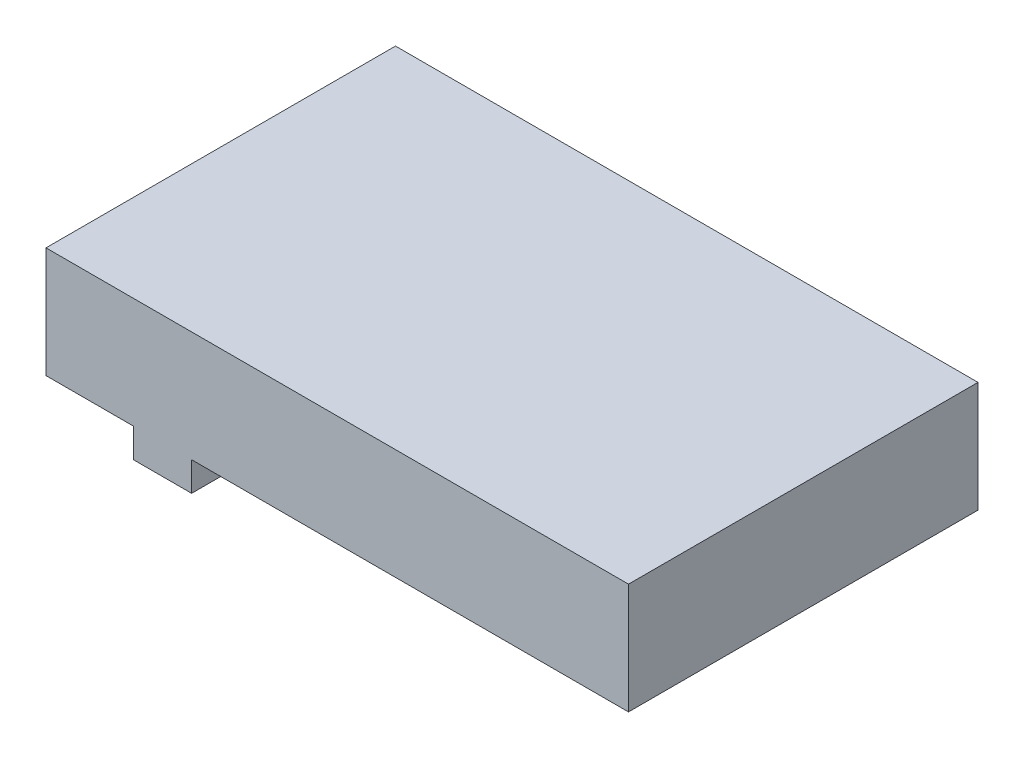
ISO-10303-21;
HEADER;
FILE_DESCRIPTION(('STEP AP214'),'2;1');
FILE_NAME('part.step','',(''),(''),'','','');
FILE_SCHEMA(('AUTOMOTIVE_DESIGN { 1 0 10303 214 1 1 1 1 }'));
ENDSEC;
DATA;
#1=APPLICATION_CONTEXT('core data for automotive mechanical design processes');
#2=APPLICATION_PROTOCOL_DEFINITION('international standard','automotive_design',2000,#1);
#3=PRODUCT_CONTEXT('',#1,'mechanical');
#4=PRODUCT('Part','Part','',(#3));
#5=PRODUCT_RELATED_PRODUCT_CATEGORY('part','',(#4));
#6=PRODUCT_DEFINITION_FORMATION('','',#4);
#7=PRODUCT_DEFINITION_CONTEXT('part definition',#1,'design');
#8=PRODUCT_DEFINITION('design','',#6,#7);
#9=PRODUCT_DEFINITION_SHAPE('','',#8);
#10=(LENGTH_UNIT() NAMED_UNIT(*) SI_UNIT(.MILLI.,.METRE.));
#11=(NAMED_UNIT(*) PLANE_ANGLE_UNIT() SI_UNIT($,.RADIAN.));
#12=(NAMED_UNIT(*) SI_UNIT($,.STERADIAN.) SOLID_ANGLE_UNIT());
#13=UNCERTAINTY_MEASURE_WITH_UNIT(LENGTH_MEASURE(1.E-05),#10,'distance_accuracy_value','');
#14=(GEOMETRIC_REPRESENTATION_CONTEXT(3) GLOBAL_UNCERTAINTY_ASSIGNED_CONTEXT((#13)) GLOBAL_UNIT_ASSIGNED_CONTEXT((#10,
#11,#12)) REPRESENTATION_CONTEXT('',''));
#15=CARTESIAN_POINT('',(0.,0.,0.));
#16=DIRECTION('',(0.,0.,1.));
#17=DIRECTION('',(1.,0.,0.));
#18=AXIS2_PLACEMENT_3D('',#15,#16,#17);
#19=CARTESIAN_POINT('',(-12.7,-2.413,15.24));
#20=DIRECTION('',(0.,1.,0.));
#21=DIRECTION('',(0.,0.,1.));
#22=AXIS2_PLACEMENT_3D('',#19,#20,#21);
#23=PLANE('',#22);
#24=DIRECTION('',(0.,0.,1.));
#25=VECTOR('',#24,1.);
#26=CARTESIAN_POINT('',(-6.35,-2.413,0.));
#27=LINE('',#26,#25);
#28=CARTESIAN_POINT('',(-6.35,-2.413,0.));
#29=VERTEX_POINT('',#28);
#30=CARTESIAN_POINT('',(-6.35,-2.413,15.24));
#31=VERTEX_POINT('',#30);
#32=EDGE_CURVE('E153',#29,#31,#27,.T.);
#33=ORIENTED_EDGE('',*,*,#32,.F.);
#34=DIRECTION('',(1.,0.,0.));
#35=VECTOR('',#34,1.);
#36=CARTESIAN_POINT('',(-12.7,-2.413,0.));
#37=LINE('',#36,#35);
#38=CARTESIAN_POINT('',(12.7,-2.413,0.));
#39=VERTEX_POINT('',#38);
#40=EDGE_CURVE('E86',#29,#39,#37,.T.);
#41=ORIENTED_EDGE('',*,*,#40,.T.);
#42=DIRECTION('',(0.,0.,-1.));
#43=VECTOR('',#42,1.);
#44=CARTESIAN_POINT('',(12.7,-2.413,15.24));
#45=LINE('',#44,#43);
#46=CARTESIAN_POINT('',(12.7,-2.413,15.24));
#47=VERTEX_POINT('',#46);
#48=EDGE_CURVE('E171',#47,#39,#45,.T.);
#49=ORIENTED_EDGE('',*,*,#48,.F.);
#50=DIRECTION('',(1.,0.,0.));
#51=VECTOR('',#50,1.);
#52=CARTESIAN_POINT('',(-12.7,-2.413,15.24));
#53=LINE('',#52,#51);
#54=EDGE_CURVE('E64',#31,#47,#53,.T.);
#55=ORIENTED_EDGE('',*,*,#54,.F.);
#56=EDGE_LOOP('',(#33,#41,#49,#55));
#57=FACE_BOUND('',#56,.T.);
#58=ADVANCED_FACE('F39',(#57),#23,.F.);
#59=CARTESIAN_POINT('',(12.7,-2.413,15.24));
#60=DIRECTION('',(-1.,0.,0.));
#61=DIRECTION('',(0.,0.,1.));
#62=AXIS2_PLACEMENT_3D('',#59,#60,#61);
#63=PLANE('',#62);
#64=DIRECTION('',(0.,1.,0.));
#65=VECTOR('',#64,1.);
#66=CARTESIAN_POINT('',(12.7,-2.413,0.));
#67=LINE('',#66,#65);
#68=CARTESIAN_POINT('',(12.7,2.413,0.));
#69=VERTEX_POINT('',#68);
#70=EDGE_CURVE('E152',#39,#69,#67,.T.);
#71=ORIENTED_EDGE('',*,*,#70,.T.);
#72=DIRECTION('',(0.,0.,-1.));
#73=VECTOR('',#72,1.);
#74=CARTESIAN_POINT('',(12.7,2.413,15.24));
#75=LINE('',#74,#73);
#76=CARTESIAN_POINT('',(12.7,2.413,15.24));
#77=VERTEX_POINT('',#76);
#78=EDGE_CURVE('E11',#77,#69,#75,.T.);
#79=ORIENTED_EDGE('',*,*,#78,.F.);
#80=DIRECTION('',(0.,1.,0.));
#81=VECTOR('',#80,1.);
#82=CARTESIAN_POINT('',(12.7,-2.413,15.24));
#83=LINE('',#82,#81);
#84=EDGE_CURVE('E158',#47,#77,#83,.T.);
#85=ORIENTED_EDGE('',*,*,#84,.F.);
#86=ORIENTED_EDGE('',*,*,#48,.T.);
#87=EDGE_LOOP('',(#71,#79,#85,#86));
#88=FACE_BOUND('',#87,.T.);
#89=ADVANCED_FACE('F41',(#88),#63,.F.);
#90=CARTESIAN_POINT('',(-12.7,2.413,15.24));
#91=DIRECTION('',(0.,-1.,0.));
#92=DIRECTION('',(0.,0.,-1.));
#93=AXIS2_PLACEMENT_3D('',#90,#91,#92);
#94=PLANE('',#93);
#95=DIRECTION('',(-1.,0.,0.));
#96=VECTOR('',#95,1.);
#97=CARTESIAN_POINT('',(-12.7,2.413,0.));
#98=LINE('',#97,#96);
#99=CARTESIAN_POINT('',(-12.7,2.413,0.));
#100=VERTEX_POINT('',#99);
#101=EDGE_CURVE('E175',#69,#100,#98,.T.);
#102=ORIENTED_EDGE('',*,*,#101,.T.);
#103=DIRECTION('',(0.,0.,-1.));
#104=VECTOR('',#103,1.);
#105=CARTESIAN_POINT('',(-12.7,2.413,15.24));
#106=LINE('',#105,#104);
#107=CARTESIAN_POINT('',(-12.7,2.413,15.24));
#108=VERTEX_POINT('',#107);
#109=EDGE_CURVE('E48',#108,#100,#106,.T.);
#110=ORIENTED_EDGE('',*,*,#109,.F.);
#111=DIRECTION('',(-1.,0.,0.));
#112=VECTOR('',#111,1.);
#113=CARTESIAN_POINT('',(-12.7,2.413,15.24));
#114=LINE('',#113,#112);
#115=EDGE_CURVE('E93',#77,#108,#114,.T.);
#116=ORIENTED_EDGE('',*,*,#115,.F.);
#117=ORIENTED_EDGE('',*,*,#78,.T.);
#118=EDGE_LOOP('',(#102,#110,#116,#117));
#119=FACE_BOUND('',#118,.T.);
#120=ADVANCED_FACE('F202',(#119),#94,.F.);
#121=CARTESIAN_POINT('',(-12.7,-2.413,15.24));
#122=DIRECTION('',(1.,0.,0.));
#123=DIRECTION('',(0.,0.,-1.));
#124=AXIS2_PLACEMENT_3D('',#121,#122,#123);
#125=PLANE('',#124);
#126=DIRECTION('',(0.,-1.,0.));
#127=VECTOR('',#126,1.);
#128=CARTESIAN_POINT('',(-12.7,-2.413,0.));
#129=LINE('',#128,#127);
#130=CARTESIAN_POINT('',(-12.7,-2.413,0.));
#131=VERTEX_POINT('',#130);
#132=EDGE_CURVE('E178',#100,#131,#129,.T.);
#133=ORIENTED_EDGE('',*,*,#132,.T.);
#134=DIRECTION('',(0.,0.,-1.));
#135=VECTOR('',#134,1.);
#136=CARTESIAN_POINT('',(-12.7,-2.413,15.24));
#137=LINE('',#136,#135);
#138=CARTESIAN_POINT('',(-12.7,-2.413,15.24));
#139=VERTEX_POINT('',#138);
#140=EDGE_CURVE('E185',#139,#131,#137,.T.);
#141=ORIENTED_EDGE('',*,*,#140,.F.);
#142=DIRECTION('',(0.,-1.,0.));
#143=VECTOR('',#142,1.);
#144=CARTESIAN_POINT('',(-12.7,-2.413,15.24));
#145=LINE('',#144,#143);
#146=EDGE_CURVE('E164',#108,#139,#145,.T.);
#147=ORIENTED_EDGE('',*,*,#146,.F.);
#148=ORIENTED_EDGE('',*,*,#109,.T.);
#149=EDGE_LOOP('',(#133,#141,#147,#148));
#150=FACE_BOUND('',#149,.T.);
#151=ADVANCED_FACE('F193',(#150),#125,.F.);
#152=CARTESIAN_POINT('',(-8.89,-2.413,0.));
#153=VERTEX_POINT('',#152);
#154=EDGE_CURVE('E161',#131,#153,#37,.T.);
#155=ORIENTED_EDGE('',*,*,#154,.T.);
#156=DIRECTION('',(0.,0.,1.));
#157=VECTOR('',#156,1.);
#158=CARTESIAN_POINT('',(-8.89,-2.413,0.));
#159=LINE('',#158,#157);
#160=CARTESIAN_POINT('',(-8.89,-2.413,15.24));
#161=VERTEX_POINT('',#160);
#162=EDGE_CURVE('E137',#153,#161,#159,.T.);
#163=ORIENTED_EDGE('',*,*,#162,.T.);
#164=EDGE_CURVE('E167',#139,#161,#53,.T.);
#165=ORIENTED_EDGE('',*,*,#164,.F.);
#166=ORIENTED_EDGE('',*,*,#140,.T.);
#167=EDGE_LOOP('',(#155,#163,#165,#166));
#168=FACE_BOUND('',#167,.T.);
#169=ADVANCED_FACE('F196',(#168),#23,.F.);
#170=CARTESIAN_POINT('',(0.,0.,15.24));
#171=DIRECTION('',(0.,0.,-1.));
#172=DIRECTION('',(-1.,0.,0.));
#173=AXIS2_PLACEMENT_3D('',#170,#171,#172);
#174=PLANE('',#173);
#175=ORIENTED_EDGE('',*,*,#84,.T.);
#176=ORIENTED_EDGE('',*,*,#115,.T.);
#177=ORIENTED_EDGE('',*,*,#146,.T.);
#178=ORIENTED_EDGE('',*,*,#164,.T.);
#179=DIRECTION('',(0.,-1.,0.));
#180=VECTOR('',#179,1.);
#181=CARTESIAN_POINT('',(-8.89,-2.413,15.24));
#182=LINE('',#181,#180);
#183=CARTESIAN_POINT('',(-8.89,-3.683,15.24));
#184=VERTEX_POINT('',#183);
#185=EDGE_CURVE('E55',#161,#184,#182,.T.);
#186=ORIENTED_EDGE('',*,*,#185,.T.);
#187=DIRECTION('',(1.,0.,0.));
#188=VECTOR('',#187,1.);
#189=CARTESIAN_POINT('',(-8.89,-3.683,15.24));
#190=LINE('',#189,#188);
#191=CARTESIAN_POINT('',(-6.35,-3.683,15.24));
#192=VERTEX_POINT('',#191);
#193=EDGE_CURVE('E120',#184,#192,#190,.T.);
#194=ORIENTED_EDGE('',*,*,#193,.T.);
#195=DIRECTION('',(0.,1.,0.));
#196=VECTOR('',#195,1.);
#197=CARTESIAN_POINT('',(-6.35,-2.413,15.24));
#198=LINE('',#197,#196);
#199=EDGE_CURVE('E139',#192,#31,#198,.T.);
#200=ORIENTED_EDGE('',*,*,#199,.T.);
#201=ORIENTED_EDGE('',*,*,#54,.T.);
#202=EDGE_LOOP('',(#175,#176,#177,#178,#186,#194,#200,#201));
#203=FACE_BOUND('',#202,.T.);
#204=ADVANCED_FACE('F198',(#203),#174,.F.);
#205=CARTESIAN_POINT('',(0.,0.,0.));
#206=DIRECTION('',(0.,0.,-1.));
#207=DIRECTION('',(-1.,0.,0.));
#208=AXIS2_PLACEMENT_3D('',#205,#206,#207);
#209=PLANE('',#208);
#210=ORIENTED_EDGE('',*,*,#70,.F.);
#211=ORIENTED_EDGE('',*,*,#40,.F.);
#212=DIRECTION('',(0.,1.,0.));
#213=VECTOR('',#212,1.);
#214=CARTESIAN_POINT('',(-6.35,-2.413,0.));
#215=LINE('',#214,#213);
#216=CARTESIAN_POINT('',(-6.35,-3.683,0.));
#217=VERTEX_POINT('',#216);
#218=EDGE_CURVE('E124',#217,#29,#215,.T.);
#219=ORIENTED_EDGE('',*,*,#218,.F.);
#220=DIRECTION('',(1.,0.,0.));
#221=VECTOR('',#220,1.);
#222=CARTESIAN_POINT('',(-8.89,-3.683,0.));
#223=LINE('',#222,#221);
#224=CARTESIAN_POINT('',(-8.89,-3.683,0.));
#225=VERTEX_POINT('',#224);
#226=EDGE_CURVE('E118',#225,#217,#223,.T.);
#227=ORIENTED_EDGE('',*,*,#226,.F.);
#228=DIRECTION('',(0.,-1.,0.));
#229=VECTOR('',#228,1.);
#230=CARTESIAN_POINT('',(-8.89,-2.413,0.));
#231=LINE('',#230,#229);
#232=EDGE_CURVE('E132',#153,#225,#231,.T.);
#233=ORIENTED_EDGE('',*,*,#232,.F.);
#234=ORIENTED_EDGE('',*,*,#154,.F.);
#235=ORIENTED_EDGE('',*,*,#132,.F.);
#236=ORIENTED_EDGE('',*,*,#101,.F.);
#237=EDGE_LOOP('',(#210,#211,#219,#227,#233,#234,#235,#236));
#238=FACE_BOUND('',#237,.T.);
#239=ADVANCED_FACE('F130',(#238),#209,.T.);
#240=CARTESIAN_POINT('',(-8.89,-2.413,0.));
#241=DIRECTION('',(-1.,0.,0.));
#242=DIRECTION('',(0.,0.,1.));
#243=AXIS2_PLACEMENT_3D('',#240,#241,#242);
#244=PLANE('',#243);
#245=ORIENTED_EDGE('',*,*,#185,.F.);
#246=ORIENTED_EDGE('',*,*,#162,.F.);
#247=ORIENTED_EDGE('',*,*,#232,.T.);
#248=DIRECTION('',(0.,0.,1.));
#249=VECTOR('',#248,1.);
#250=CARTESIAN_POINT('',(-8.89,-3.683,0.));
#251=LINE('',#250,#249);
#252=EDGE_CURVE('E115',#225,#184,#251,.T.);
#253=ORIENTED_EDGE('',*,*,#252,.T.);
#254=EDGE_LOOP('',(#245,#246,#247,#253));
#255=FACE_BOUND('',#254,.T.);
#256=ADVANCED_FACE('F136',(#255),#244,.T.);
#257=CARTESIAN_POINT('',(-6.35,-2.413,0.));
#258=DIRECTION('',(1.,0.,0.));
#259=DIRECTION('',(0.,0.,-1.));
#260=AXIS2_PLACEMENT_3D('',#257,#258,#259);
#261=PLANE('',#260);
#262=ORIENTED_EDGE('',*,*,#199,.F.);
#263=DIRECTION('',(0.,0.,1.));
#264=VECTOR('',#263,1.);
#265=CARTESIAN_POINT('',(-6.35,-3.683,0.));
#266=LINE('',#265,#264);
#267=EDGE_CURVE('E123',#217,#192,#266,.T.);
#268=ORIENTED_EDGE('',*,*,#267,.F.);
#269=ORIENTED_EDGE('',*,*,#218,.T.);
#270=ORIENTED_EDGE('',*,*,#32,.T.);
#271=EDGE_LOOP('',(#262,#268,#269,#270));
#272=FACE_BOUND('',#271,.T.);
#273=ADVANCED_FACE('F225',(#272),#261,.T.);
#274=CARTESIAN_POINT('',(-8.89,-3.683,0.));
#275=DIRECTION('',(0.,-1.,0.));
#276=DIRECTION('',(1.,0.,0.));
#277=AXIS2_PLACEMENT_3D('',#274,#275,#276);
#278=PLANE('',#277);
#279=ORIENTED_EDGE('',*,*,#193,.F.);
#280=ORIENTED_EDGE('',*,*,#252,.F.);
#281=ORIENTED_EDGE('',*,*,#226,.T.);
#282=ORIENTED_EDGE('',*,*,#267,.T.);
#283=EDGE_LOOP('',(#279,#280,#281,#282));
#284=FACE_BOUND('',#283,.T.);
#285=ADVANCED_FACE('F117',(#284),#278,.T.);
#286=CLOSED_SHELL('',(#58,#89,#120,#151,#169,#204,#239,#256,#273,#285));
#287=MANIFOLD_SOLID_BREP('B2',#286);
#288=ADVANCED_BREP_SHAPE_REPRESENTATION('',(#18,#287),#14);
#289=SHAPE_DEFINITION_REPRESENTATION(#9,#288);
ENDSEC;
END-ISO-10303-21;
